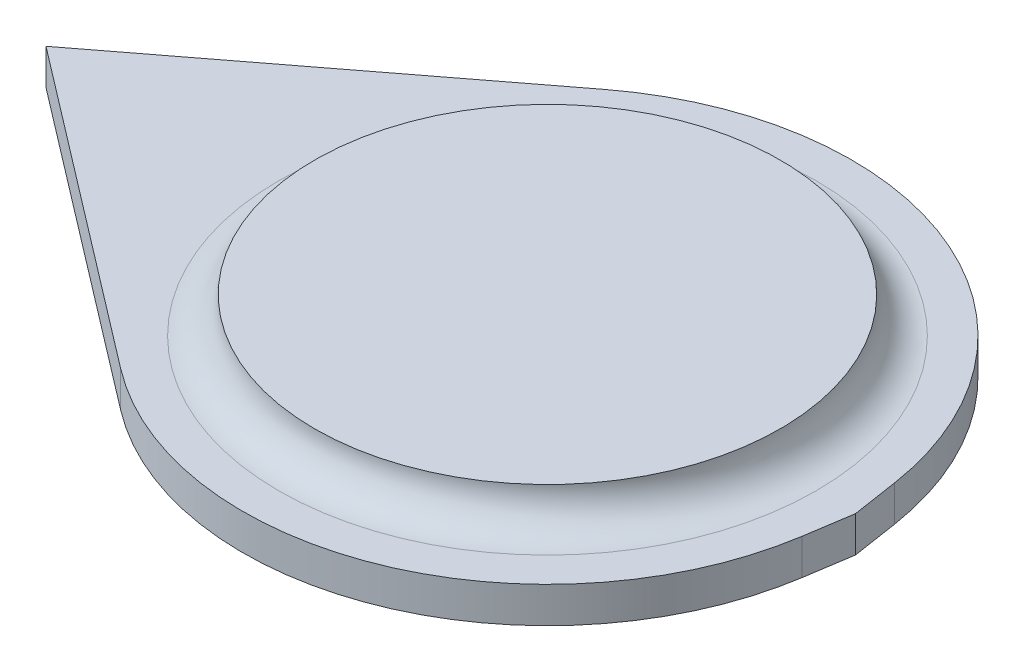
ISO-10303-21;
HEADER;
FILE_DESCRIPTION(('STEP AP214'),'2;1');
FILE_NAME('part.step','',(''),(''),'','','');
FILE_SCHEMA(('AUTOMOTIVE_DESIGN { 1 0 10303 214 1 1 1 1 }'));
ENDSEC;
DATA;
#1=APPLICATION_CONTEXT('core data for automotive mechanical design processes');
#2=APPLICATION_PROTOCOL_DEFINITION('international standard','automotive_design',2000,#1);
#3=PRODUCT_CONTEXT('',#1,'mechanical');
#4=PRODUCT('Part','Part','',(#3));
#5=PRODUCT_RELATED_PRODUCT_CATEGORY('part','',(#4));
#6=PRODUCT_DEFINITION_FORMATION('','',#4);
#7=PRODUCT_DEFINITION_CONTEXT('part definition',#1,'design');
#8=PRODUCT_DEFINITION('design','',#6,#7);
#9=PRODUCT_DEFINITION_SHAPE('','',#8);
#10=(LENGTH_UNIT() NAMED_UNIT(*) SI_UNIT(.MILLI.,.METRE.));
#11=(NAMED_UNIT(*) PLANE_ANGLE_UNIT() SI_UNIT($,.RADIAN.));
#12=(NAMED_UNIT(*) SI_UNIT($,.STERADIAN.) SOLID_ANGLE_UNIT());
#13=UNCERTAINTY_MEASURE_WITH_UNIT(LENGTH_MEASURE(1.E-05),#10,'distance_accuracy_value','');
#14=(GEOMETRIC_REPRESENTATION_CONTEXT(3) GLOBAL_UNCERTAINTY_ASSIGNED_CONTEXT((#13)) GLOBAL_UNIT_ASSIGNED_CONTEXT((#10,
#11,#12)) REPRESENTATION_CONTEXT('',''));
#15=CARTESIAN_POINT('',(0.,0.,0.));
#16=DIRECTION('',(0.,0.,1.));
#17=DIRECTION('',(1.,0.,0.));
#18=AXIS2_PLACEMENT_3D('',#15,#16,#17);
#19=CARTESIAN_POINT('',(-70.,5.,0.));
#20=DIRECTION('',(0.607142857142857,0.,-0.794592695045964));
#21=DIRECTION('',(-0.794592695045964,0.,-0.607142857142857));
#22=AXIS2_PLACEMENT_3D('',#19,#20,#21);
#23=PLANE('',#22);
#24=DIRECTION('',(0.794592695045964,0.,0.607142857142857));
#25=VECTOR('',#24,1.);
#26=CARTESIAN_POINT('',(-70.,0.,0.));
#27=LINE('',#26,#25);
#28=CARTESIAN_POINT('',(-70.,0.,0.));
#29=VERTEX_POINT('',#28);
#30=CARTESIAN_POINT('',(-25.8035714285714,0.,33.7701895394535));
#31=VERTEX_POINT('',#30);
#32=EDGE_CURVE('E131',#29,#31,#27,.T.);
#33=ORIENTED_EDGE('',*,*,#32,.T.);
#34=DIRECTION('',(0.,-1.,0.));
#35=VECTOR('',#34,1.);
#36=CARTESIAN_POINT('',(-25.8035714285714,5.,33.7701895394535));
#37=LINE('',#36,#35);
#38=CARTESIAN_POINT('',(-25.8035714285714,5.,33.7701895394535));
#39=VERTEX_POINT('',#38);
#40=EDGE_CURVE('E49',#39,#31,#37,.T.);
#41=ORIENTED_EDGE('',*,*,#40,.F.);
#42=DIRECTION('',(0.794592695045964,0.,0.607142857142857));
#43=VECTOR('',#42,1.);
#44=CARTESIAN_POINT('',(-70.,5.,0.));
#45=LINE('',#44,#43);
#46=CARTESIAN_POINT('',(-70.,5.,0.));
#47=VERTEX_POINT('',#46);
#48=EDGE_CURVE('E150',#47,#39,#45,.T.);
#49=ORIENTED_EDGE('',*,*,#48,.F.);
#50=DIRECTION('',(0.,-1.,0.));
#51=VECTOR('',#50,1.);
#52=CARTESIAN_POINT('',(-70.,5.,0.));
#53=LINE('',#52,#51);
#54=EDGE_CURVE('E130',#47,#29,#53,.T.);
#55=ORIENTED_EDGE('',*,*,#54,.T.);
#56=EDGE_LOOP('',(#33,#41,#49,#55));
#57=FACE_BOUND('',#56,.T.);
#58=ADVANCED_FACE('F39',(#57),#23,.F.);
#59=CARTESIAN_POINT('',(0.,5.,0.));
#60=DIRECTION('',(0.,-1.,0.));
#61=DIRECTION('',(0.,0.,-1.));
#62=AXIS2_PLACEMENT_3D('',#59,#60,#61);
#63=CYLINDRICAL_SURFACE('',#62,42.5);
#64=CARTESIAN_POINT('',(0.,0.,0.));
#65=DIRECTION('',(0.,1.,0.));
#66=DIRECTION('',(0.,0.,1.));
#67=AXIS2_PLACEMENT_3D('',#64,#65,#66);
#68=CIRCLE('',#67,42.5);
#69=CARTESIAN_POINT('',(42.0058139534884,0.,6.46232110815618));
#70=VERTEX_POINT('',#69);
#71=EDGE_CURVE('E135',#31,#70,#68,.T.);
#72=ORIENTED_EDGE('',*,*,#71,.T.);
#73=DIRECTION('',(0.,-1.,0.));
#74=VECTOR('',#73,1.);
#75=CARTESIAN_POINT('',(42.0058139534884,5.,6.46232110815618));
#76=LINE('',#75,#74);
#77=CARTESIAN_POINT('',(42.0058139534884,5.,6.46232110815618));
#78=VERTEX_POINT('',#77);
#79=EDGE_CURVE('E157',#78,#70,#76,.T.);
#80=ORIENTED_EDGE('',*,*,#79,.F.);
#81=CARTESIAN_POINT('',(0.,5.,0.));
#82=DIRECTION('',(0.,1.,0.));
#83=DIRECTION('',(0.,0.,1.));
#84=AXIS2_PLACEMENT_3D('',#81,#82,#83);
#85=CIRCLE('',#84,42.5);
#86=EDGE_CURVE('E94',#39,#78,#85,.T.);
#87=ORIENTED_EDGE('',*,*,#86,.F.);
#88=ORIENTED_EDGE('',*,*,#40,.T.);
#89=EDGE_LOOP('',(#72,#80,#87,#88));
#90=FACE_BOUND('',#89,.T.);
#91=ADVANCED_FACE('F161',(#90),#63,.T.);
#92=CARTESIAN_POINT('',(43.,5.,0.));
#93=DIRECTION('',(0.988372093023256,0.,0.152054614309555));
#94=DIRECTION('',(0.152054614309555,0.,-0.988372093023256));
#95=AXIS2_PLACEMENT_3D('',#92,#93,#94);
#96=PLANE('',#95);
#97=DIRECTION('',(-0.152054614309555,0.,0.988372093023256));
#98=VECTOR('',#97,1.);
#99=CARTESIAN_POINT('',(43.,0.,0.));
#100=LINE('',#99,#98);
#101=CARTESIAN_POINT('',(43.,0.,0.));
#102=VERTEX_POINT('',#101);
#103=EDGE_CURVE('E140',#102,#70,#100,.T.);
#104=ORIENTED_EDGE('',*,*,#103,.F.);
#105=DIRECTION('',(0.,-1.,0.));
#106=VECTOR('',#105,1.);
#107=CARTESIAN_POINT('',(43.,5.,0.));
#108=LINE('',#107,#106);
#109=CARTESIAN_POINT('',(43.,5.,0.));
#110=VERTEX_POINT('',#109);
#111=EDGE_CURVE('E111',#110,#102,#108,.T.);
#112=ORIENTED_EDGE('',*,*,#111,.F.);
#113=DIRECTION('',(-0.152054614309555,0.,0.988372093023256));
#114=VECTOR('',#113,1.);
#115=CARTESIAN_POINT('',(43.,5.,0.));
#116=LINE('',#115,#114);
#117=EDGE_CURVE('E121',#110,#78,#116,.T.);
#118=ORIENTED_EDGE('',*,*,#117,.T.);
#119=ORIENTED_EDGE('',*,*,#79,.T.);
#120=EDGE_LOOP('',(#104,#112,#118,#119));
#121=FACE_BOUND('',#120,.T.);
#122=ADVANCED_FACE('F169',(#121),#96,.T.);
#123=CARTESIAN_POINT('',(42.0058139534884,5.,-6.46232110815619));
#124=DIRECTION('',(0.988372093023256,0.,-0.152054614309556));
#125=DIRECTION('',(-0.152054614309556,0.,-0.988372093023256));
#126=AXIS2_PLACEMENT_3D('',#123,#124,#125);
#127=PLANE('',#126);
#128=DIRECTION('',(0.152054614309556,0.,0.988372093023256));
#129=VECTOR('',#128,1.);
#130=CARTESIAN_POINT('',(42.0058139534884,0.,-6.46232110815619));
#131=LINE('',#130,#129);
#132=CARTESIAN_POINT('',(42.0058139534884,0.,-6.46232110815619));
#133=VERTEX_POINT('',#132);
#134=EDGE_CURVE('E109',#133,#102,#131,.T.);
#135=ORIENTED_EDGE('',*,*,#134,.F.);
#136=DIRECTION('',(0.,-1.,0.));
#137=VECTOR('',#136,1.);
#138=CARTESIAN_POINT('',(42.0058139534884,5.,-6.46232110815619));
#139=LINE('',#138,#137);
#140=CARTESIAN_POINT('',(42.0058139534884,5.,-6.46232110815619));
#141=VERTEX_POINT('',#140);
#142=EDGE_CURVE('E103',#141,#133,#139,.T.);
#143=ORIENTED_EDGE('',*,*,#142,.F.);
#144=DIRECTION('',(0.152054614309556,0.,0.988372093023256));
#145=VECTOR('',#144,1.);
#146=CARTESIAN_POINT('',(42.0058139534884,5.,-6.46232110815619));
#147=LINE('',#146,#145);
#148=EDGE_CURVE('E107',#141,#110,#147,.T.);
#149=ORIENTED_EDGE('',*,*,#148,.T.);
#150=ORIENTED_EDGE('',*,*,#111,.T.);
#151=EDGE_LOOP('',(#135,#143,#149,#150));
#152=FACE_BOUND('',#151,.T.);
#153=ADVANCED_FACE('F105',(#152),#127,.T.);
#154=CARTESIAN_POINT('',(0.,5.,0.));
#155=DIRECTION('',(0.,-1.,0.));
#156=DIRECTION('',(0.,0.,-1.));
#157=AXIS2_PLACEMENT_3D('',#154,#155,#156);
#158=CYLINDRICAL_SURFACE('',#157,42.5);
#159=CARTESIAN_POINT('',(0.,0.,0.));
#160=DIRECTION('',(0.,1.,0.));
#161=DIRECTION('',(0.,0.,1.));
#162=AXIS2_PLACEMENT_3D('',#159,#160,#161);
#163=CIRCLE('',#162,42.5);
#164=CARTESIAN_POINT('',(-25.8035714285714,0.,-33.7701895394535));
#165=VERTEX_POINT('',#164);
#166=EDGE_CURVE('E79',#133,#165,#163,.T.);
#167=ORIENTED_EDGE('',*,*,#166,.T.);
#168=DIRECTION('',(0.,-1.,0.));
#169=VECTOR('',#168,1.);
#170=CARTESIAN_POINT('',(-25.8035714285714,5.,-33.7701895394535));
#171=LINE('',#170,#169);
#172=CARTESIAN_POINT('',(-25.8035714285714,5.,-33.7701895394535));
#173=VERTEX_POINT('',#172);
#174=EDGE_CURVE('E112',#173,#165,#171,.T.);
#175=ORIENTED_EDGE('',*,*,#174,.F.);
#176=CARTESIAN_POINT('',(0.,5.,0.));
#177=DIRECTION('',(0.,1.,0.));
#178=DIRECTION('',(0.,0.,1.));
#179=AXIS2_PLACEMENT_3D('',#176,#177,#178);
#180=CIRCLE('',#179,42.5);
#181=EDGE_CURVE('E114',#141,#173,#180,.T.);
#182=ORIENTED_EDGE('',*,*,#181,.F.);
#183=ORIENTED_EDGE('',*,*,#142,.T.);
#184=EDGE_LOOP('',(#167,#175,#182,#183));
#185=FACE_BOUND('',#184,.T.);
#186=ADVANCED_FACE('F115',(#185),#158,.T.);
#187=CARTESIAN_POINT('',(-25.8035714285714,5.,-33.7701895394535));
#188=DIRECTION('',(0.607142857142857,0.,0.794592695045964));
#189=DIRECTION('',(0.794592695045964,0.,-0.607142857142857));
#190=AXIS2_PLACEMENT_3D('',#187,#188,#189);
#191=PLANE('',#190);
#192=DIRECTION('',(-0.794592695045964,0.,0.607142857142857));
#193=VECTOR('',#192,1.);
#194=CARTESIAN_POINT('',(-25.8035714285714,0.,-33.7701895394535));
#195=LINE('',#194,#193);
#196=EDGE_CURVE('E85',#165,#29,#195,.T.);
#197=ORIENTED_EDGE('',*,*,#196,.T.);
#198=ORIENTED_EDGE('',*,*,#54,.F.);
#199=DIRECTION('',(-0.794592695045964,0.,0.607142857142857));
#200=VECTOR('',#199,1.);
#201=CARTESIAN_POINT('',(-25.8035714285714,5.,-33.7701895394535));
#202=LINE('',#201,#200);
#203=EDGE_CURVE('E57',#173,#47,#202,.T.);
#204=ORIENTED_EDGE('',*,*,#203,.F.);
#205=ORIENTED_EDGE('',*,*,#174,.T.);
#206=EDGE_LOOP('',(#197,#198,#204,#205));
#207=FACE_BOUND('',#206,.T.);
#208=ADVANCED_FACE('F204',(#207),#191,.F.);
#209=CARTESIAN_POINT('',(0.,5.,0.));
#210=DIRECTION('',(0.,1.,0.));
#211=DIRECTION('',(0.,0.,1.));
#212=AXIS2_PLACEMENT_3D('',#209,#210,#211);
#213=PLANE('',#212);
#214=CARTESIAN_POINT('',(0.,5.,0.));
#215=DIRECTION('',(0.,1.,0.));
#216=DIRECTION('',(0.,0.,1.));
#217=AXIS2_PLACEMENT_3D('',#214,#215,#216);
#218=CIRCLE('',#217,37.5);
#219=CARTESIAN_POINT('',(0.,5.,37.5));
#220=VERTEX_POINT('',#219);
#221=EDGE_CURVE('E11',#220,#220,#218,.F.);
#222=ORIENTED_EDGE('',*,*,#221,.T.);
#223=EDGE_LOOP('',(#222));
#224=FACE_BOUND('',#223,.T.);
#225=ORIENTED_EDGE('',*,*,#48,.T.);
#226=ORIENTED_EDGE('',*,*,#86,.T.);
#227=ORIENTED_EDGE('',*,*,#117,.F.);
#228=ORIENTED_EDGE('',*,*,#148,.F.);
#229=ORIENTED_EDGE('',*,*,#181,.T.);
#230=ORIENTED_EDGE('',*,*,#203,.T.);
#231=EDGE_LOOP('',(#225,#226,#227,#228,#229,#230));
#232=FACE_BOUND('',#231,.T.);
#233=ADVANCED_FACE('F119',(#224,#232),#213,.T.);
#234=CARTESIAN_POINT('',(0.,0.,0.));
#235=DIRECTION('',(0.,1.,0.));
#236=DIRECTION('',(0.,0.,1.));
#237=AXIS2_PLACEMENT_3D('',#234,#235,#236);
#238=PLANE('',#237);
#239=ORIENTED_EDGE('',*,*,#32,.F.);
#240=ORIENTED_EDGE('',*,*,#196,.F.);
#241=ORIENTED_EDGE('',*,*,#166,.F.);
#242=ORIENTED_EDGE('',*,*,#134,.T.);
#243=ORIENTED_EDGE('',*,*,#103,.T.);
#244=ORIENTED_EDGE('',*,*,#71,.F.);
#245=EDGE_LOOP('',(#239,#240,#241,#242,#243,#244));
#246=FACE_BOUND('',#245,.T.);
#247=ADVANCED_FACE('F166',(#246),#238,.F.);
#248=CARTESIAN_POINT('',(0.,10.,0.));
#249=DIRECTION('',(0.,1.,0.));
#250=DIRECTION('',(0.,0.,1.));
#251=AXIS2_PLACEMENT_3D('',#248,#249,#250);
#252=PLANE('',#251);
#253=CARTESIAN_POINT('',(0.,10.,0.));
#254=DIRECTION('',(0.,1.,0.));
#255=DIRECTION('',(0.,0.,1.));
#256=AXIS2_PLACEMENT_3D('',#253,#254,#255);
#257=CIRCLE('',#256,32.5);
#258=CARTESIAN_POINT('',(0.,10.,32.5));
#259=VERTEX_POINT('',#258);
#260=EDGE_CURVE('E136',#259,#259,#257,.T.);
#261=ORIENTED_EDGE('',*,*,#260,.T.);
#262=EDGE_LOOP('',(#261));
#263=FACE_BOUND('',#262,.T.);
#264=ADVANCED_FACE('F223',(#263),#252,.T.);
#265=CARTESIAN_POINT('',(0.,10.,0.));
#266=DIRECTION('',(0.,1.,0.));
#267=DIRECTION('',(0.,0.,1.));
#268=AXIS2_PLACEMENT_3D('',#265,#266,#267);
#269=TOROIDAL_SURFACE('',#268,37.5,5.);
#270=ORIENTED_EDGE('',*,*,#221,.F.);
#271=EDGE_LOOP('',(#270));
#272=FACE_BOUND('',#271,.T.);
#273=ORIENTED_EDGE('',*,*,#260,.F.);
#274=EDGE_LOOP('',(#273));
#275=FACE_BOUND('',#274,.T.);
#276=ADVANCED_FACE('F41',(#272,#275),#269,.F.);
#277=CLOSED_SHELL('',(#58,#91,#122,#153,#186,#208,#233,#247,#264,#276));
#278=MANIFOLD_SOLID_BREP('B2',#277);
#279=ADVANCED_BREP_SHAPE_REPRESENTATION('',(#18,#278),#14);
#280=SHAPE_DEFINITION_REPRESENTATION(#9,#279);
ENDSEC;
END-ISO-10303-21;
